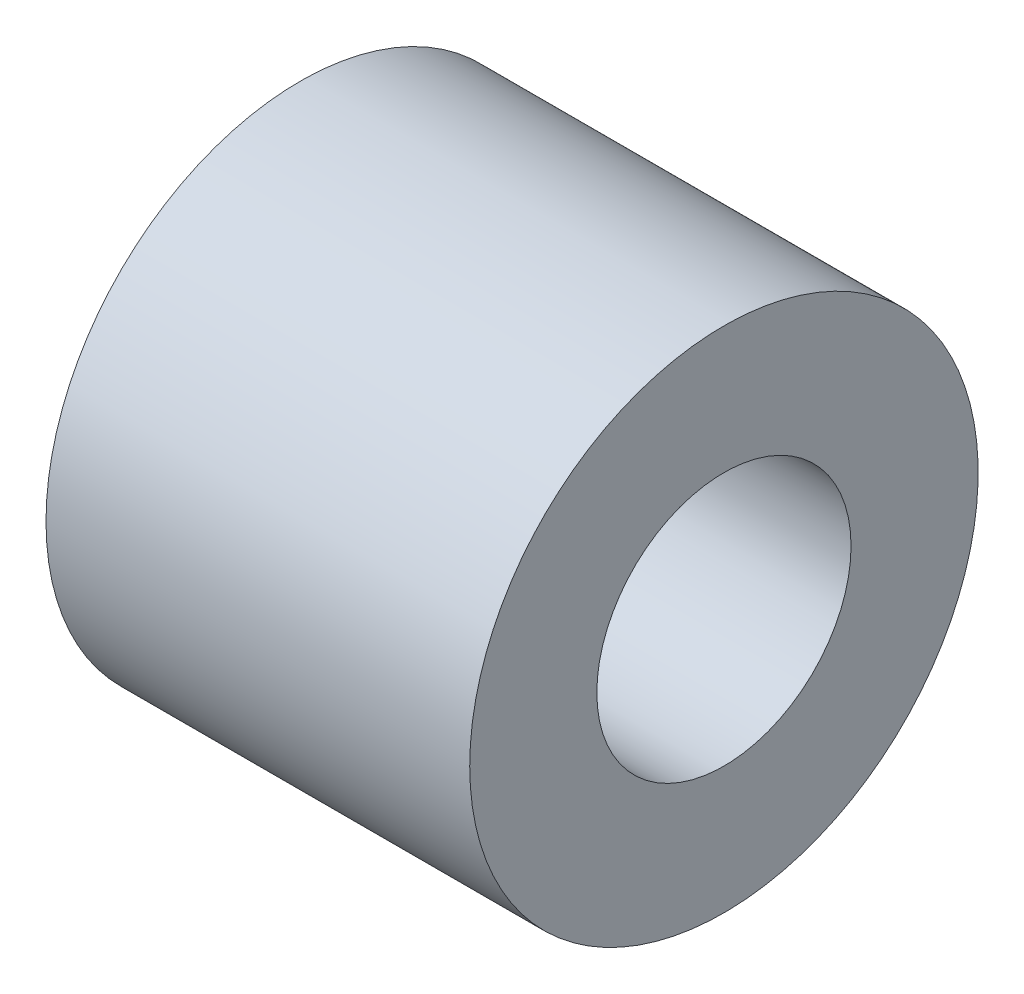
ISO-10303-21;
HEADER;
FILE_DESCRIPTION(('STEP AP214'),'2;1');
FILE_NAME('part.step','',(''),(''),'','','');
FILE_SCHEMA(('AUTOMOTIVE_DESIGN { 1 0 10303 214 1 1 1 1 }'));
ENDSEC;
DATA;
#1=APPLICATION_CONTEXT('core data for automotive mechanical design processes');
#2=APPLICATION_PROTOCOL_DEFINITION('international standard','automotive_design',2000,#1);
#3=PRODUCT_CONTEXT('',#1,'mechanical');
#4=PRODUCT('Part','Part','',(#3));
#5=PRODUCT_RELATED_PRODUCT_CATEGORY('part','',(#4));
#6=PRODUCT_DEFINITION_FORMATION('','',#4);
#7=PRODUCT_DEFINITION_CONTEXT('part definition',#1,'design');
#8=PRODUCT_DEFINITION('design','',#6,#7);
#9=PRODUCT_DEFINITION_SHAPE('','',#8);
#10=(LENGTH_UNIT() NAMED_UNIT(*) SI_UNIT(.MILLI.,.METRE.));
#11=(NAMED_UNIT(*) PLANE_ANGLE_UNIT() SI_UNIT($,.RADIAN.));
#12=(NAMED_UNIT(*) SI_UNIT($,.STERADIAN.) SOLID_ANGLE_UNIT());
#13=UNCERTAINTY_MEASURE_WITH_UNIT(LENGTH_MEASURE(1.E-05),#10,'distance_accuracy_value','');
#14=(GEOMETRIC_REPRESENTATION_CONTEXT(3) GLOBAL_UNCERTAINTY_ASSIGNED_CONTEXT((#13)) GLOBAL_UNIT_ASSIGNED_CONTEXT((#10,
#11,#12)) REPRESENTATION_CONTEXT('',''));
#15=CARTESIAN_POINT('',(0.,0.,0.));
#16=DIRECTION('',(0.,0.,1.));
#17=DIRECTION('',(1.,0.,0.));
#18=AXIS2_PLACEMENT_3D('',#15,#16,#17);
#19=CARTESIAN_POINT('',(-1000.,0.,0.));
#20=DIRECTION('',(-1.,0.,0.));
#21=DIRECTION('',(0.,0.,1.));
#22=AXIS2_PLACEMENT_3D('',#19,#20,#21);
#23=CYLINDRICAL_SURFACE('',#22,3.);
#24=CARTESIAN_POINT('',(10.,0.,0.));
#25=DIRECTION('',(-1.,0.,0.));
#26=DIRECTION('',(0.,0.,1.));
#27=AXIS2_PLACEMENT_3D('',#24,#25,#26);
#28=CIRCLE('',#27,3.);
#29=CARTESIAN_POINT('',(10.,0.,3.));
#30=VERTEX_POINT('',#29);
#31=EDGE_CURVE('E52',#30,#30,#28,.T.);
#32=ORIENTED_EDGE('',*,*,#31,.F.);
#33=EDGE_LOOP('',(#32));
#34=FACE_BOUND('',#33,.T.);
#35=CARTESIAN_POINT('',(0.,0.,0.));
#36=DIRECTION('',(-1.,0.,0.));
#37=DIRECTION('',(0.,0.,1.));
#38=AXIS2_PLACEMENT_3D('',#35,#36,#37);
#39=CIRCLE('',#38,3.);
#40=CARTESIAN_POINT('',(0.,0.,3.));
#41=VERTEX_POINT('',#40);
#42=EDGE_CURVE('E10',#41,#41,#39,.T.);
#43=ORIENTED_EDGE('',*,*,#42,.T.);
#44=EDGE_LOOP('',(#43));
#45=FACE_BOUND('',#44,.T.);
#46=ADVANCED_FACE('F39',(#34,#45),#23,.F.);
#47=CARTESIAN_POINT('',(0.,3.,0.));
#48=DIRECTION('',(1.,0.,0.));
#49=DIRECTION('',(0.,0.,-1.));
#50=AXIS2_PLACEMENT_3D('',#47,#48,#49);
#51=PLANE('',#50);
#52=ORIENTED_EDGE('',*,*,#42,.F.);
#53=EDGE_LOOP('',(#52));
#54=FACE_BOUND('',#53,.T.);
#55=CARTESIAN_POINT('',(0.,0.,0.));
#56=DIRECTION('',(-1.,0.,0.));
#57=DIRECTION('',(0.,0.,1.));
#58=AXIS2_PLACEMENT_3D('',#55,#56,#57);
#59=CIRCLE('',#58,6.);
#60=CARTESIAN_POINT('',(0.,0.,6.));
#61=VERTEX_POINT('',#60);
#62=EDGE_CURVE('E44',#61,#61,#59,.T.);
#63=ORIENTED_EDGE('',*,*,#62,.T.);
#64=EDGE_LOOP('',(#63));
#65=FACE_BOUND('',#64,.T.);
#66=ADVANCED_FACE('F65',(#54,#65),#51,.F.);
#67=CARTESIAN_POINT('',(-1000.,0.,0.));
#68=DIRECTION('',(-1.,0.,0.));
#69=DIRECTION('',(0.,0.,1.));
#70=AXIS2_PLACEMENT_3D('',#67,#68,#69);
#71=CYLINDRICAL_SURFACE('',#70,6.);
#72=ORIENTED_EDGE('',*,*,#62,.F.);
#73=EDGE_LOOP('',(#72));
#74=FACE_BOUND('',#73,.T.);
#75=CARTESIAN_POINT('',(10.,0.,0.));
#76=DIRECTION('',(-1.,0.,0.));
#77=DIRECTION('',(0.,0.,1.));
#78=AXIS2_PLACEMENT_3D('',#75,#76,#77);
#79=CIRCLE('',#78,6.);
#80=CARTESIAN_POINT('',(10.,0.,6.));
#81=VERTEX_POINT('',#80);
#82=EDGE_CURVE('E47',#81,#81,#79,.T.);
#83=ORIENTED_EDGE('',*,*,#82,.T.);
#84=EDGE_LOOP('',(#83));
#85=FACE_BOUND('',#84,.T.);
#86=ADVANCED_FACE('F67',(#74,#85),#71,.T.);
#87=CARTESIAN_POINT('',(10.,6.,0.));
#88=DIRECTION('',(-1.,0.,0.));
#89=DIRECTION('',(0.,0.,1.));
#90=AXIS2_PLACEMENT_3D('',#87,#88,#89);
#91=PLANE('',#90);
#92=ORIENTED_EDGE('',*,*,#82,.F.);
#93=EDGE_LOOP('',(#92));
#94=FACE_BOUND('',#93,.T.);
#95=ORIENTED_EDGE('',*,*,#31,.T.);
#96=EDGE_LOOP('',(#95));
#97=FACE_BOUND('',#96,.T.);
#98=ADVANCED_FACE('F56',(#94,#97),#91,.F.);
#99=CLOSED_SHELL('',(#46,#66,#86,#98));
#100=MANIFOLD_SOLID_BREP('B2',#99);
#101=ADVANCED_BREP_SHAPE_REPRESENTATION('',(#18,#100),#14);
#102=SHAPE_DEFINITION_REPRESENTATION(#9,#101);
ENDSEC;
END-ISO-10303-21;
